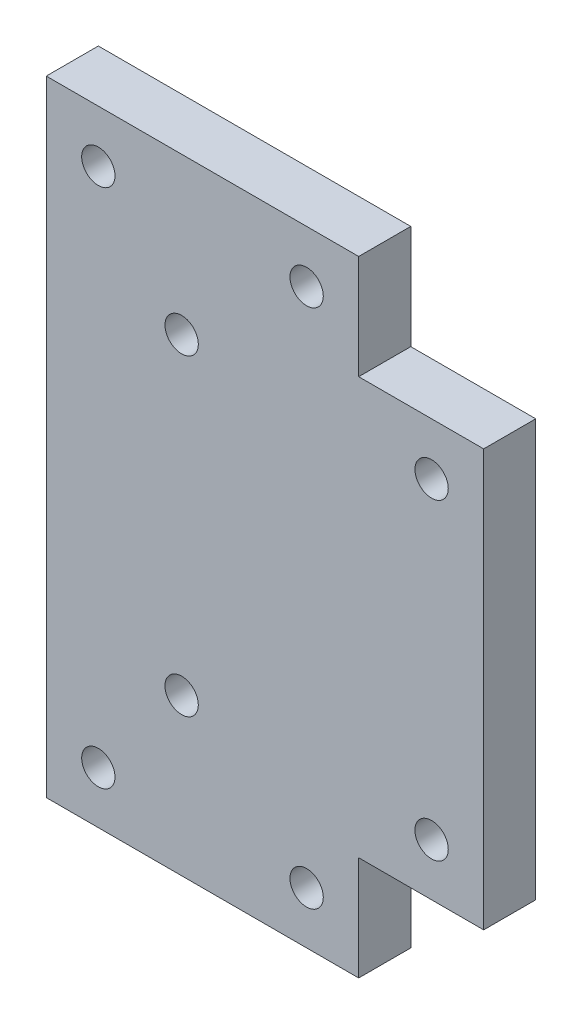
ISO-10303-21;
HEADER;
FILE_DESCRIPTION(('STEP AP214'),'2;1');
FILE_NAME('part.step','',(''),(''),'','','');
FILE_SCHEMA(('AUTOMOTIVE_DESIGN { 1 0 10303 214 1 1 1 1 }'));
ENDSEC;
DATA;
#1=APPLICATION_CONTEXT('core data for automotive mechanical design processes');
#2=APPLICATION_PROTOCOL_DEFINITION('international standard','automotive_design',2000,#1);
#3=PRODUCT_CONTEXT('',#1,'mechanical');
#4=PRODUCT('Part','Part','',(#3));
#5=PRODUCT_RELATED_PRODUCT_CATEGORY('part','',(#4));
#6=PRODUCT_DEFINITION_FORMATION('','',#4);
#7=PRODUCT_DEFINITION_CONTEXT('part definition',#1,'design');
#8=PRODUCT_DEFINITION('design','',#6,#7);
#9=PRODUCT_DEFINITION_SHAPE('','',#8);
#10=(LENGTH_UNIT() NAMED_UNIT(*) SI_UNIT(.MILLI.,.METRE.));
#11=(NAMED_UNIT(*) PLANE_ANGLE_UNIT() SI_UNIT($,.RADIAN.));
#12=(NAMED_UNIT(*) SI_UNIT($,.STERADIAN.) SOLID_ANGLE_UNIT());
#13=UNCERTAINTY_MEASURE_WITH_UNIT(LENGTH_MEASURE(1.E-05),#10,'distance_accuracy_value','');
#14=(GEOMETRIC_REPRESENTATION_CONTEXT(3) GLOBAL_UNCERTAINTY_ASSIGNED_CONTEXT((#13)) GLOBAL_UNIT_ASSIGNED_CONTEXT((#10,
#11,#12)) REPRESENTATION_CONTEXT('',''));
#15=CARTESIAN_POINT('',(0.,0.,0.));
#16=DIRECTION('',(0.,0.,1.));
#17=DIRECTION('',(1.,0.,0.));
#18=AXIS2_PLACEMENT_3D('',#15,#16,#17);
#19=CARTESIAN_POINT('',(20.,130.,5.));
#20=DIRECTION('',(1.,0.,0.));
#21=DIRECTION('',(0.,0.,-1.));
#22=AXIS2_PLACEMENT_3D('',#19,#20,#21);
#23=PLANE('',#22);
#24=DIRECTION('',(0.,0.,1.));
#25=VECTOR('',#24,1.);
#26=CARTESIAN_POINT('',(20.,210.,0.));
#27=LINE('',#26,#25);
#28=CARTESIAN_POINT('',(20.,210.,0.));
#29=VERTEX_POINT('',#28);
#30=CARTESIAN_POINT('',(20.,210.,5.));
#31=VERTEX_POINT('',#30);
#32=EDGE_CURVE('E184',#29,#31,#27,.T.);
#33=ORIENTED_EDGE('',*,*,#32,.F.);
#34=DIRECTION('',(0.,-1.,0.));
#35=VECTOR('',#34,1.);
#36=CARTESIAN_POINT('',(20.,130.,0.));
#37=LINE('',#36,#35);
#38=CARTESIAN_POINT('',(20.,150.,0.));
#39=VERTEX_POINT('',#38);
#40=EDGE_CURVE('E41',#29,#39,#37,.T.);
#41=ORIENTED_EDGE('',*,*,#40,.T.);
#42=DIRECTION('',(0.,0.,1.));
#43=VECTOR('',#42,1.);
#44=CARTESIAN_POINT('',(20.,150.,0.));
#45=LINE('',#44,#43);
#46=CARTESIAN_POINT('',(20.,150.,5.));
#47=VERTEX_POINT('',#46);
#48=EDGE_CURVE('E61',#39,#47,#45,.T.);
#49=ORIENTED_EDGE('',*,*,#48,.T.);
#50=DIRECTION('',(0.,-1.,0.));
#51=VECTOR('',#50,1.);
#52=CARTESIAN_POINT('',(20.,130.,5.));
#53=LINE('',#52,#51);
#54=EDGE_CURVE('E11',#31,#47,#53,.T.);
#55=ORIENTED_EDGE('',*,*,#54,.F.);
#56=EDGE_LOOP('',(#33,#41,#49,#55));
#57=FACE_BOUND('',#56,.T.);
#58=ADVANCED_FACE('F38',(#57),#23,.F.);
#59=CARTESIAN_POINT('',(0.,0.,5.));
#60=DIRECTION('',(0.,0.,-1.));
#61=DIRECTION('',(-1.,0.,0.));
#62=AXIS2_PLACEMENT_3D('',#59,#60,#61);
#63=PLANE('',#62);
#64=CARTESIAN_POINT('',(45.,155.,5.));
#65=DIRECTION('',(0.,0.,1.));
#66=DIRECTION('',(1.,0.,0.));
#67=AXIS2_PLACEMENT_3D('',#64,#65,#66);
#68=CIRCLE('',#67,1.6);
#69=CARTESIAN_POINT('',(46.6,155.,5.));
#70=VERTEX_POINT('',#69);
#71=EDGE_CURVE('E332',#70,#70,#68,.T.);
#72=ORIENTED_EDGE('',*,*,#71,.F.);
#73=EDGE_LOOP('',(#72));
#74=FACE_BOUND('',#73,.T.);
#75=CARTESIAN_POINT('',(25.,205.,5.));
#76=DIRECTION('',(0.,0.,1.));
#77=DIRECTION('',(1.,0.,0.));
#78=AXIS2_PLACEMENT_3D('',#75,#76,#77);
#79=CIRCLE('',#78,1.59999999999999);
#80=CARTESIAN_POINT('',(26.6,205.,5.));
#81=VERTEX_POINT('',#80);
#82=EDGE_CURVE('E338',#81,#81,#79,.T.);
#83=ORIENTED_EDGE('',*,*,#82,.F.);
#84=EDGE_LOOP('',(#83));
#85=FACE_BOUND('',#84,.T.);
#86=CARTESIAN_POINT('',(25.,155.,5.));
#87=DIRECTION('',(0.,0.,1.));
#88=DIRECTION('',(1.,0.,0.));
#89=AXIS2_PLACEMENT_3D('',#86,#87,#88);
#90=CIRCLE('',#89,1.59999999999999);
#91=CARTESIAN_POINT('',(26.6,155.,5.));
#92=VERTEX_POINT('',#91);
#93=EDGE_CURVE('E344',#92,#92,#90,.T.);
#94=ORIENTED_EDGE('',*,*,#93,.F.);
#95=EDGE_LOOP('',(#94));
#96=FACE_BOUND('',#95,.T.);
#97=CARTESIAN_POINT('',(45.,205.,5.));
#98=DIRECTION('',(0.,0.,1.));
#99=DIRECTION('',(1.,0.,0.));
#100=AXIS2_PLACEMENT_3D('',#97,#98,#99);
#101=CIRCLE('',#100,1.6);
#102=CARTESIAN_POINT('',(46.6,205.,5.));
#103=VERTEX_POINT('',#102);
#104=EDGE_CURVE('E134',#103,#103,#101,.T.);
#105=ORIENTED_EDGE('',*,*,#104,.F.);
#106=EDGE_LOOP('',(#105));
#107=FACE_BOUND('',#106,.T.);
#108=CARTESIAN_POINT('',(33.,195.,5.));
#109=DIRECTION('',(0.,0.,1.));
#110=DIRECTION('',(1.,0.,0.));
#111=AXIS2_PLACEMENT_3D('',#108,#109,#110);
#112=CIRCLE('',#111,1.6);
#113=CARTESIAN_POINT('',(34.6,195.,5.));
#114=VERTEX_POINT('',#113);
#115=EDGE_CURVE('E203',#114,#114,#112,.T.);
#116=ORIENTED_EDGE('',*,*,#115,.F.);
#117=EDGE_LOOP('',(#116));
#118=FACE_BOUND('',#117,.T.);
#119=CARTESIAN_POINT('',(57.,165.,5.));
#120=DIRECTION('',(0.,0.,1.));
#121=DIRECTION('',(1.,0.,0.));
#122=AXIS2_PLACEMENT_3D('',#119,#120,#121);
#123=CIRCLE('',#122,1.6);
#124=CARTESIAN_POINT('',(58.6,165.,5.));
#125=VERTEX_POINT('',#124);
#126=EDGE_CURVE('E188',#125,#125,#123,.T.);
#127=ORIENTED_EDGE('',*,*,#126,.F.);
#128=EDGE_LOOP('',(#127));
#129=FACE_BOUND('',#128,.T.);
#130=CARTESIAN_POINT('',(33.,165.,5.));
#131=DIRECTION('',(0.,0.,1.));
#132=DIRECTION('',(1.,0.,0.));
#133=AXIS2_PLACEMENT_3D('',#130,#131,#132);
#134=CIRCLE('',#133,1.6);
#135=CARTESIAN_POINT('',(34.6,165.,5.));
#136=VERTEX_POINT('',#135);
#137=EDGE_CURVE('E195',#136,#136,#134,.T.);
#138=ORIENTED_EDGE('',*,*,#137,.F.);
#139=EDGE_LOOP('',(#138));
#140=FACE_BOUND('',#139,.T.);
#141=CARTESIAN_POINT('',(57.,195.,5.));
#142=DIRECTION('',(0.,0.,1.));
#143=DIRECTION('',(1.,0.,0.));
#144=AXIS2_PLACEMENT_3D('',#141,#142,#143);
#145=CIRCLE('',#144,1.6);
#146=CARTESIAN_POINT('',(58.6,195.,5.));
#147=VERTEX_POINT('',#146);
#148=EDGE_CURVE('E204',#147,#147,#145,.T.);
#149=ORIENTED_EDGE('',*,*,#148,.F.);
#150=EDGE_LOOP('',(#149));
#151=FACE_BOUND('',#150,.T.);
#152=DIRECTION('',(-1.,0.,0.));
#153=VECTOR('',#152,1.);
#154=CARTESIAN_POINT('',(62.,200.,5.));
#155=LINE('',#154,#153);
#156=CARTESIAN_POINT('',(62.,200.,5.));
#157=VERTEX_POINT('',#156);
#158=CARTESIAN_POINT('',(50.,200.,5.));
#159=VERTEX_POINT('',#158);
#160=EDGE_CURVE('E139',#157,#159,#155,.T.);
#161=ORIENTED_EDGE('',*,*,#160,.T.);
#162=DIRECTION('',(0.,1.,0.));
#163=VECTOR('',#162,1.);
#164=CARTESIAN_POINT('',(50.,210.,5.));
#165=LINE('',#164,#163);
#166=CARTESIAN_POINT('',(50.,210.,5.));
#167=VERTEX_POINT('',#166);
#168=EDGE_CURVE('E142',#159,#167,#165,.T.);
#169=ORIENTED_EDGE('',*,*,#168,.T.);
#170=DIRECTION('',(-1.,0.,0.));
#171=VECTOR('',#170,1.);
#172=CARTESIAN_POINT('',(20.,210.,5.));
#173=LINE('',#172,#171);
#174=EDGE_CURVE('E177',#167,#31,#173,.T.);
#175=ORIENTED_EDGE('',*,*,#174,.T.);
#176=ORIENTED_EDGE('',*,*,#54,.T.);
#177=DIRECTION('',(1.,0.,0.));
#178=VECTOR('',#177,1.);
#179=CARTESIAN_POINT('',(20.,150.,5.));
#180=LINE('',#179,#178);
#181=CARTESIAN_POINT('',(50.,150.,5.));
#182=VERTEX_POINT('',#181);
#183=EDGE_CURVE('E126',#47,#182,#180,.T.);
#184=ORIENTED_EDGE('',*,*,#183,.T.);
#185=DIRECTION('',(0.,1.,0.));
#186=VECTOR('',#185,1.);
#187=CARTESIAN_POINT('',(50.,150.,5.));
#188=LINE('',#187,#186);
#189=CARTESIAN_POINT('',(50.,160.,5.));
#190=VERTEX_POINT('',#189);
#191=EDGE_CURVE('E53',#182,#190,#188,.T.);
#192=ORIENTED_EDGE('',*,*,#191,.T.);
#193=DIRECTION('',(1.,0.,0.));
#194=VECTOR('',#193,1.);
#195=CARTESIAN_POINT('',(62.,160.,5.));
#196=LINE('',#195,#194);
#197=CARTESIAN_POINT('',(62.,160.,5.));
#198=VERTEX_POINT('',#197);
#199=EDGE_CURVE('E115',#190,#198,#196,.T.);
#200=ORIENTED_EDGE('',*,*,#199,.T.);
#201=DIRECTION('',(0.,1.,0.));
#202=VECTOR('',#201,1.);
#203=CARTESIAN_POINT('',(62.,160.,5.));
#204=LINE('',#203,#202);
#205=EDGE_CURVE('E121',#198,#157,#204,.T.);
#206=ORIENTED_EDGE('',*,*,#205,.T.);
#207=EDGE_LOOP('',(#161,#169,#175,#176,#184,#192,#200,#206));
#208=FACE_BOUND('',#207,.T.);
#209=ADVANCED_FACE('F125',(#74,#85,#96,#107,#118,#129,#140,#151,#208),#63,.F.);
#210=CARTESIAN_POINT('',(0.,0.,0.));
#211=DIRECTION('',(0.,0.,-1.));
#212=DIRECTION('',(-1.,0.,0.));
#213=AXIS2_PLACEMENT_3D('',#210,#211,#212);
#214=PLANE('',#213);
#215=CARTESIAN_POINT('',(45.,155.,0.));
#216=DIRECTION('',(0.,0.,1.));
#217=DIRECTION('',(1.,0.,0.));
#218=AXIS2_PLACEMENT_3D('',#215,#216,#217);
#219=CIRCLE('',#218,1.6);
#220=CARTESIAN_POINT('',(46.6,155.,0.));
#221=VERTEX_POINT('',#220);
#222=EDGE_CURVE('E316',#221,#221,#219,.T.);
#223=ORIENTED_EDGE('',*,*,#222,.T.);
#224=EDGE_LOOP('',(#223));
#225=FACE_BOUND('',#224,.T.);
#226=CARTESIAN_POINT('',(25.,205.,0.));
#227=DIRECTION('',(0.,0.,1.));
#228=DIRECTION('',(1.,0.,0.));
#229=AXIS2_PLACEMENT_3D('',#226,#227,#228);
#230=CIRCLE('',#229,1.59999999999999);
#231=CARTESIAN_POINT('',(26.6,205.,0.));
#232=VERTEX_POINT('',#231);
#233=EDGE_CURVE('E320',#232,#232,#230,.T.);
#234=ORIENTED_EDGE('',*,*,#233,.T.);
#235=EDGE_LOOP('',(#234));
#236=FACE_BOUND('',#235,.T.);
#237=CARTESIAN_POINT('',(25.,155.,0.));
#238=DIRECTION('',(0.,0.,1.));
#239=DIRECTION('',(1.,0.,0.));
#240=AXIS2_PLACEMENT_3D('',#237,#238,#239);
#241=CIRCLE('',#240,1.59999999999999);
#242=CARTESIAN_POINT('',(26.6,155.,0.));
#243=VERTEX_POINT('',#242);
#244=EDGE_CURVE('E324',#243,#243,#241,.T.);
#245=ORIENTED_EDGE('',*,*,#244,.T.);
#246=EDGE_LOOP('',(#245));
#247=FACE_BOUND('',#246,.T.);
#248=CARTESIAN_POINT('',(45.,205.,0.));
#249=DIRECTION('',(0.,0.,1.));
#250=DIRECTION('',(1.,0.,0.));
#251=AXIS2_PLACEMENT_3D('',#248,#249,#250);
#252=CIRCLE('',#251,1.6);
#253=CARTESIAN_POINT('',(46.6,205.,0.));
#254=VERTEX_POINT('',#253);
#255=EDGE_CURVE('E149',#254,#254,#252,.T.);
#256=ORIENTED_EDGE('',*,*,#255,.T.);
#257=EDGE_LOOP('',(#256));
#258=FACE_BOUND('',#257,.T.);
#259=DIRECTION('',(0.,1.,0.));
#260=VECTOR('',#259,1.);
#261=CARTESIAN_POINT('',(50.,210.,0.));
#262=LINE('',#261,#260);
#263=CARTESIAN_POINT('',(50.,200.,0.));
#264=VERTEX_POINT('',#263);
#265=CARTESIAN_POINT('',(50.,210.,0.));
#266=VERTEX_POINT('',#265);
#267=EDGE_CURVE('E128',#264,#266,#262,.T.);
#268=ORIENTED_EDGE('',*,*,#267,.F.);
#269=DIRECTION('',(-1.,0.,0.));
#270=VECTOR('',#269,1.);
#271=CARTESIAN_POINT('',(62.,200.,0.));
#272=LINE('',#271,#270);
#273=CARTESIAN_POINT('',(62.,200.,0.));
#274=VERTEX_POINT('',#273);
#275=EDGE_CURVE('E131',#274,#264,#272,.T.);
#276=ORIENTED_EDGE('',*,*,#275,.F.);
#277=DIRECTION('',(0.,1.,0.));
#278=VECTOR('',#277,1.);
#279=CARTESIAN_POINT('',(62.,160.,0.));
#280=LINE('',#279,#278);
#281=CARTESIAN_POINT('',(62.,160.,0.));
#282=VERTEX_POINT('',#281);
#283=EDGE_CURVE('E152',#282,#274,#280,.T.);
#284=ORIENTED_EDGE('',*,*,#283,.F.);
#285=DIRECTION('',(1.,0.,0.));
#286=VECTOR('',#285,1.);
#287=CARTESIAN_POINT('',(62.,160.,0.));
#288=LINE('',#287,#286);
#289=CARTESIAN_POINT('',(50.,160.,0.));
#290=VERTEX_POINT('',#289);
#291=EDGE_CURVE('E148',#290,#282,#288,.T.);
#292=ORIENTED_EDGE('',*,*,#291,.F.);
#293=DIRECTION('',(0.,1.,0.));
#294=VECTOR('',#293,1.);
#295=CARTESIAN_POINT('',(50.,150.,0.));
#296=LINE('',#295,#294);
#297=CARTESIAN_POINT('',(50.,150.,0.));
#298=VERTEX_POINT('',#297);
#299=EDGE_CURVE('E106',#298,#290,#296,.T.);
#300=ORIENTED_EDGE('',*,*,#299,.F.);
#301=DIRECTION('',(1.,0.,0.));
#302=VECTOR('',#301,1.);
#303=CARTESIAN_POINT('',(20.,150.,0.));
#304=LINE('',#303,#302);
#305=EDGE_CURVE('E173',#39,#298,#304,.T.);
#306=ORIENTED_EDGE('',*,*,#305,.F.);
#307=ORIENTED_EDGE('',*,*,#40,.F.);
#308=DIRECTION('',(-1.,0.,0.));
#309=VECTOR('',#308,1.);
#310=CARTESIAN_POINT('',(20.,210.,0.));
#311=LINE('',#310,#309);
#312=EDGE_CURVE('E176',#266,#29,#311,.T.);
#313=ORIENTED_EDGE('',*,*,#312,.F.);
#314=EDGE_LOOP('',(#268,#276,#284,#292,#300,#306,#307,#313));
#315=FACE_BOUND('',#314,.T.);
#316=CARTESIAN_POINT('',(33.,195.,0.));
#317=DIRECTION('',(0.,0.,1.));
#318=DIRECTION('',(1.,0.,0.));
#319=AXIS2_PLACEMENT_3D('',#316,#317,#318);
#320=CIRCLE('',#319,1.6);
#321=CARTESIAN_POINT('',(34.6,195.,0.));
#322=VERTEX_POINT('',#321);
#323=EDGE_CURVE('E215',#322,#322,#320,.T.);
#324=ORIENTED_EDGE('',*,*,#323,.T.);
#325=EDGE_LOOP('',(#324));
#326=FACE_BOUND('',#325,.T.);
#327=CARTESIAN_POINT('',(57.,165.,0.));
#328=DIRECTION('',(0.,0.,1.));
#329=DIRECTION('',(1.,0.,0.));
#330=AXIS2_PLACEMENT_3D('',#327,#328,#329);
#331=CIRCLE('',#330,1.6);
#332=CARTESIAN_POINT('',(58.6,165.,0.));
#333=VERTEX_POINT('',#332);
#334=EDGE_CURVE('E191',#333,#333,#331,.T.);
#335=ORIENTED_EDGE('',*,*,#334,.T.);
#336=EDGE_LOOP('',(#335));
#337=FACE_BOUND('',#336,.T.);
#338=CARTESIAN_POINT('',(33.,165.,0.));
#339=DIRECTION('',(0.,0.,1.));
#340=DIRECTION('',(1.,0.,0.));
#341=AXIS2_PLACEMENT_3D('',#338,#339,#340);
#342=CIRCLE('',#341,1.6);
#343=CARTESIAN_POINT('',(34.6,165.,0.));
#344=VERTEX_POINT('',#343);
#345=EDGE_CURVE('E208',#344,#344,#342,.T.);
#346=ORIENTED_EDGE('',*,*,#345,.T.);
#347=EDGE_LOOP('',(#346));
#348=FACE_BOUND('',#347,.T.);
#349=CARTESIAN_POINT('',(57.,195.,0.));
#350=DIRECTION('',(0.,0.,1.));
#351=DIRECTION('',(1.,0.,0.));
#352=AXIS2_PLACEMENT_3D('',#349,#350,#351);
#353=CIRCLE('',#352,1.6);
#354=CARTESIAN_POINT('',(58.6,195.,0.));
#355=VERTEX_POINT('',#354);
#356=EDGE_CURVE('E199',#355,#355,#353,.T.);
#357=ORIENTED_EDGE('',*,*,#356,.T.);
#358=EDGE_LOOP('',(#357));
#359=FACE_BOUND('',#358,.T.);
#360=ADVANCED_FACE('F227',(#225,#236,#247,#258,#315,#326,#337,#348,#359),#214,.T.);
#361=CARTESIAN_POINT('',(33.,195.,0.));
#362=DIRECTION('',(0.,0.,1.));
#363=DIRECTION('',(1.,0.,0.));
#364=AXIS2_PLACEMENT_3D('',#361,#362,#363);
#365=CYLINDRICAL_SURFACE('',#364,1.6);
#366=ORIENTED_EDGE('',*,*,#323,.F.);
#367=EDGE_LOOP('',(#366));
#368=FACE_BOUND('',#367,.T.);
#369=ORIENTED_EDGE('',*,*,#115,.T.);
#370=EDGE_LOOP('',(#369));
#371=FACE_BOUND('',#370,.T.);
#372=ADVANCED_FACE('F223',(#368,#371),#365,.F.);
#373=CARTESIAN_POINT('',(57.,165.,0.));
#374=DIRECTION('',(0.,0.,1.));
#375=DIRECTION('',(1.,0.,0.));
#376=AXIS2_PLACEMENT_3D('',#373,#374,#375);
#377=CYLINDRICAL_SURFACE('',#376,1.6);
#378=ORIENTED_EDGE('',*,*,#334,.F.);
#379=EDGE_LOOP('',(#378));
#380=FACE_BOUND('',#379,.T.);
#381=ORIENTED_EDGE('',*,*,#126,.T.);
#382=EDGE_LOOP('',(#381));
#383=FACE_BOUND('',#382,.T.);
#384=ADVANCED_FACE('F250',(#380,#383),#377,.F.);
#385=CARTESIAN_POINT('',(33.,165.,0.));
#386=DIRECTION('',(0.,0.,1.));
#387=DIRECTION('',(1.,0.,0.));
#388=AXIS2_PLACEMENT_3D('',#385,#386,#387);
#389=CYLINDRICAL_SURFACE('',#388,1.6);
#390=ORIENTED_EDGE('',*,*,#345,.F.);
#391=EDGE_LOOP('',(#390));
#392=FACE_BOUND('',#391,.T.);
#393=ORIENTED_EDGE('',*,*,#137,.T.);
#394=EDGE_LOOP('',(#393));
#395=FACE_BOUND('',#394,.T.);
#396=ADVANCED_FACE('F239',(#392,#395),#389,.F.);
#397=CARTESIAN_POINT('',(57.,195.,0.));
#398=DIRECTION('',(0.,0.,1.));
#399=DIRECTION('',(1.,0.,0.));
#400=AXIS2_PLACEMENT_3D('',#397,#398,#399);
#401=CYLINDRICAL_SURFACE('',#400,1.6);
#402=ORIENTED_EDGE('',*,*,#356,.F.);
#403=EDGE_LOOP('',(#402));
#404=FACE_BOUND('',#403,.T.);
#405=ORIENTED_EDGE('',*,*,#148,.T.);
#406=EDGE_LOOP('',(#405));
#407=FACE_BOUND('',#406,.T.);
#408=ADVANCED_FACE('F236',(#404,#407),#401,.F.);
#409=CARTESIAN_POINT('',(20.,210.,0.));
#410=DIRECTION('',(0.,1.,0.));
#411=DIRECTION('',(0.,0.,1.));
#412=AXIS2_PLACEMENT_3D('',#409,#410,#411);
#413=PLANE('',#412);
#414=DIRECTION('',(0.,0.,-1.));
#415=VECTOR('',#414,1.);
#416=CARTESIAN_POINT('',(50.,210.,5.));
#417=LINE('',#416,#415);
#418=EDGE_CURVE('E159',#167,#266,#417,.T.);
#419=ORIENTED_EDGE('',*,*,#418,.T.);
#420=ORIENTED_EDGE('',*,*,#312,.T.);
#421=ORIENTED_EDGE('',*,*,#32,.T.);
#422=ORIENTED_EDGE('',*,*,#174,.F.);
#423=EDGE_LOOP('',(#419,#420,#421,#422));
#424=FACE_BOUND('',#423,.T.);
#425=ADVANCED_FACE('F238',(#424),#413,.T.);
#426=CARTESIAN_POINT('',(20.,150.,0.));
#427=DIRECTION('',(0.,-1.,0.));
#428=DIRECTION('',(0.,0.,-1.));
#429=AXIS2_PLACEMENT_3D('',#426,#427,#428);
#430=PLANE('',#429);
#431=DIRECTION('',(0.,0.,-1.));
#432=VECTOR('',#431,1.);
#433=CARTESIAN_POINT('',(50.,150.,5.));
#434=LINE('',#433,#432);
#435=EDGE_CURVE('E112',#182,#298,#434,.T.);
#436=ORIENTED_EDGE('',*,*,#435,.F.);
#437=ORIENTED_EDGE('',*,*,#183,.F.);
#438=ORIENTED_EDGE('',*,*,#48,.F.);
#439=ORIENTED_EDGE('',*,*,#305,.T.);
#440=EDGE_LOOP('',(#436,#437,#438,#439));
#441=FACE_BOUND('',#440,.T.);
#442=ADVANCED_FACE('F247',(#441),#430,.T.);
#443=CARTESIAN_POINT('',(50.,210.,5.));
#444=DIRECTION('',(-1.,0.,0.));
#445=DIRECTION('',(0.,0.,1.));
#446=AXIS2_PLACEMENT_3D('',#443,#444,#445);
#447=PLANE('',#446);
#448=ORIENTED_EDGE('',*,*,#267,.T.);
#449=ORIENTED_EDGE('',*,*,#418,.F.);
#450=ORIENTED_EDGE('',*,*,#168,.F.);
#451=DIRECTION('',(0.,0.,-1.));
#452=VECTOR('',#451,1.);
#453=CARTESIAN_POINT('',(50.,200.,5.));
#454=LINE('',#453,#452);
#455=EDGE_CURVE('E163',#159,#264,#454,.T.);
#456=ORIENTED_EDGE('',*,*,#455,.T.);
#457=EDGE_LOOP('',(#448,#449,#450,#456));
#458=FACE_BOUND('',#457,.T.);
#459=ADVANCED_FACE('F272',(#458),#447,.F.);
#460=CARTESIAN_POINT('',(62.,200.,5.));
#461=DIRECTION('',(0.,-1.,0.));
#462=DIRECTION('',(0.,0.,-1.));
#463=AXIS2_PLACEMENT_3D('',#460,#461,#462);
#464=PLANE('',#463);
#465=ORIENTED_EDGE('',*,*,#275,.T.);
#466=ORIENTED_EDGE('',*,*,#455,.F.);
#467=ORIENTED_EDGE('',*,*,#160,.F.);
#468=DIRECTION('',(0.,0.,-1.));
#469=VECTOR('',#468,1.);
#470=CARTESIAN_POINT('',(62.,200.,5.));
#471=LINE('',#470,#469);
#472=EDGE_CURVE('E166',#157,#274,#471,.T.);
#473=ORIENTED_EDGE('',*,*,#472,.T.);
#474=EDGE_LOOP('',(#465,#466,#467,#473));
#475=FACE_BOUND('',#474,.T.);
#476=ADVANCED_FACE('F276',(#475),#464,.F.);
#477=CARTESIAN_POINT('',(62.,160.,5.));
#478=DIRECTION('',(-1.,0.,0.));
#479=DIRECTION('',(0.,0.,1.));
#480=AXIS2_PLACEMENT_3D('',#477,#478,#479);
#481=PLANE('',#480);
#482=ORIENTED_EDGE('',*,*,#283,.T.);
#483=ORIENTED_EDGE('',*,*,#472,.F.);
#484=ORIENTED_EDGE('',*,*,#205,.F.);
#485=DIRECTION('',(0.,0.,-1.));
#486=VECTOR('',#485,1.);
#487=CARTESIAN_POINT('',(62.,160.,5.));
#488=LINE('',#487,#486);
#489=EDGE_CURVE('E111',#198,#282,#488,.T.);
#490=ORIENTED_EDGE('',*,*,#489,.T.);
#491=EDGE_LOOP('',(#482,#483,#484,#490));
#492=FACE_BOUND('',#491,.T.);
#493=ADVANCED_FACE('F279',(#492),#481,.F.);
#494=CARTESIAN_POINT('',(62.,160.,5.));
#495=DIRECTION('',(0.,1.,0.));
#496=DIRECTION('',(0.,0.,1.));
#497=AXIS2_PLACEMENT_3D('',#494,#495,#496);
#498=PLANE('',#497);
#499=ORIENTED_EDGE('',*,*,#291,.T.);
#500=ORIENTED_EDGE('',*,*,#489,.F.);
#501=ORIENTED_EDGE('',*,*,#199,.F.);
#502=DIRECTION('',(0.,0.,-1.));
#503=VECTOR('',#502,1.);
#504=CARTESIAN_POINT('',(50.,160.,5.));
#505=LINE('',#504,#503);
#506=EDGE_CURVE('E102',#190,#290,#505,.T.);
#507=ORIENTED_EDGE('',*,*,#506,.T.);
#508=EDGE_LOOP('',(#499,#500,#501,#507));
#509=FACE_BOUND('',#508,.T.);
#510=ADVANCED_FACE('F116',(#509),#498,.F.);
#511=CARTESIAN_POINT('',(50.,150.,5.));
#512=DIRECTION('',(-1.,0.,0.));
#513=DIRECTION('',(0.,0.,1.));
#514=AXIS2_PLACEMENT_3D('',#511,#512,#513);
#515=PLANE('',#514);
#516=ORIENTED_EDGE('',*,*,#299,.T.);
#517=ORIENTED_EDGE('',*,*,#506,.F.);
#518=ORIENTED_EDGE('',*,*,#191,.F.);
#519=ORIENTED_EDGE('',*,*,#435,.T.);
#520=EDGE_LOOP('',(#516,#517,#518,#519));
#521=FACE_BOUND('',#520,.T.);
#522=ADVANCED_FACE('F104',(#521),#515,.F.);
#523=CARTESIAN_POINT('',(45.,205.,0.));
#524=DIRECTION('',(0.,0.,1.));
#525=DIRECTION('',(1.,0.,0.));
#526=AXIS2_PLACEMENT_3D('',#523,#524,#525);
#527=CYLINDRICAL_SURFACE('',#526,1.6);
#528=ORIENTED_EDGE('',*,*,#255,.F.);
#529=EDGE_LOOP('',(#528));
#530=FACE_BOUND('',#529,.T.);
#531=ORIENTED_EDGE('',*,*,#104,.T.);
#532=EDGE_LOOP('',(#531));
#533=FACE_BOUND('',#532,.T.);
#534=ADVANCED_FACE('F291',(#530,#533),#527,.F.);
#535=CARTESIAN_POINT('',(25.,155.,0.));
#536=DIRECTION('',(0.,0.,1.));
#537=DIRECTION('',(1.,0.,0.));
#538=AXIS2_PLACEMENT_3D('',#535,#536,#537);
#539=CYLINDRICAL_SURFACE('',#538,1.59999999999999);
#540=ORIENTED_EDGE('',*,*,#244,.F.);
#541=EDGE_LOOP('',(#540));
#542=FACE_BOUND('',#541,.T.);
#543=ORIENTED_EDGE('',*,*,#93,.T.);
#544=EDGE_LOOP('',(#543));
#545=FACE_BOUND('',#544,.T.);
#546=ADVANCED_FACE('F351',(#542,#545),#539,.F.);
#547=CARTESIAN_POINT('',(25.,205.,0.));
#548=DIRECTION('',(0.,0.,1.));
#549=DIRECTION('',(1.,0.,0.));
#550=AXIS2_PLACEMENT_3D('',#547,#548,#549);
#551=CYLINDRICAL_SURFACE('',#550,1.59999999999999);
#552=ORIENTED_EDGE('',*,*,#233,.F.);
#553=EDGE_LOOP('',(#552));
#554=FACE_BOUND('',#553,.T.);
#555=ORIENTED_EDGE('',*,*,#82,.T.);
#556=EDGE_LOOP('',(#555));
#557=FACE_BOUND('',#556,.T.);
#558=ADVANCED_FACE('F360',(#554,#557),#551,.F.);
#559=CARTESIAN_POINT('',(45.,155.,0.));
#560=DIRECTION('',(0.,0.,1.));
#561=DIRECTION('',(1.,0.,0.));
#562=AXIS2_PLACEMENT_3D('',#559,#560,#561);
#563=CYLINDRICAL_SURFACE('',#562,1.6);
#564=ORIENTED_EDGE('',*,*,#222,.F.);
#565=EDGE_LOOP('',(#564));
#566=FACE_BOUND('',#565,.T.);
#567=ORIENTED_EDGE('',*,*,#71,.T.);
#568=EDGE_LOOP('',(#567));
#569=FACE_BOUND('',#568,.T.);
#570=ADVANCED_FACE('F364',(#566,#569),#563,.F.);
#571=CLOSED_SHELL('',(#58,#209,#360,#372,#384,#396,#408,#425,#442,#459,#476,#493,#510,#522,#534,
#546,#558,#570));
#572=MANIFOLD_SOLID_BREP('B2',#571);
#573=ADVANCED_BREP_SHAPE_REPRESENTATION('',(#18,#572),#14);
#574=SHAPE_DEFINITION_REPRESENTATION(#9,#573);
ENDSEC;
END-ISO-10303-21;
